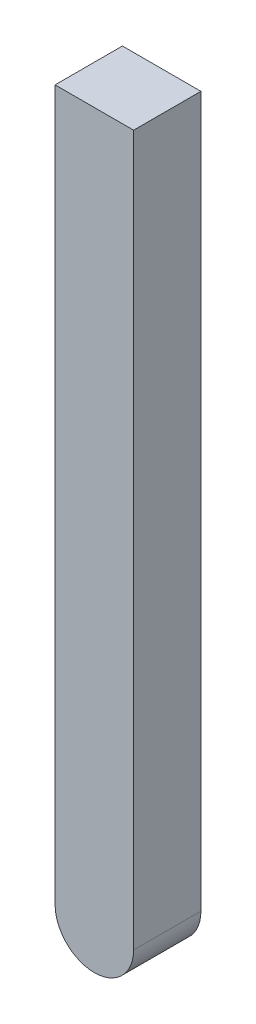
ISO-10303-21;
HEADER;
FILE_DESCRIPTION(('STEP AP214'),'2;1');
FILE_NAME('part.step','',(''),(''),'','','');
FILE_SCHEMA(('AUTOMOTIVE_DESIGN { 1 0 10303 214 1 1 1 1 }'));
ENDSEC;
DATA;
#1=APPLICATION_CONTEXT('core data for automotive mechanical design processes');
#2=APPLICATION_PROTOCOL_DEFINITION('international standard','automotive_design',2000,#1);
#3=PRODUCT_CONTEXT('',#1,'mechanical');
#4=PRODUCT('Part','Part','',(#3));
#5=PRODUCT_RELATED_PRODUCT_CATEGORY('part','',(#4));
#6=PRODUCT_DEFINITION_FORMATION('','',#4);
#7=PRODUCT_DEFINITION_CONTEXT('part definition',#1,'design');
#8=PRODUCT_DEFINITION('design','',#6,#7);
#9=PRODUCT_DEFINITION_SHAPE('','',#8);
#10=(LENGTH_UNIT() NAMED_UNIT(*) SI_UNIT(.MILLI.,.METRE.));
#11=(NAMED_UNIT(*) PLANE_ANGLE_UNIT() SI_UNIT($,.RADIAN.));
#12=(NAMED_UNIT(*) SI_UNIT($,.STERADIAN.) SOLID_ANGLE_UNIT());
#13=UNCERTAINTY_MEASURE_WITH_UNIT(LENGTH_MEASURE(1.E-05),#10,'distance_accuracy_value','');
#14=(GEOMETRIC_REPRESENTATION_CONTEXT(3) GLOBAL_UNCERTAINTY_ASSIGNED_CONTEXT((#13)) GLOBAL_UNIT_ASSIGNED_CONTEXT((#10,
#11,#12)) REPRESENTATION_CONTEXT('',''));
#15=CARTESIAN_POINT('',(0.,0.,0.));
#16=DIRECTION('',(0.,0.,1.));
#17=DIRECTION('',(1.,0.,0.));
#18=AXIS2_PLACEMENT_3D('',#15,#16,#17);
#19=CARTESIAN_POINT('',(0.350000000000001,3.165,0.3));
#20=DIRECTION('',(0.,-1.,0.));
#21=DIRECTION('',(0.,0.,-1.));
#22=AXIS2_PLACEMENT_3D('',#19,#20,#21);
#23=PLANE('',#22);
#24=DIRECTION('',(-1.,0.,0.));
#25=VECTOR('',#24,1.);
#26=CARTESIAN_POINT('',(0.350000000000001,3.165,-0.3));
#27=LINE('',#26,#25);
#28=CARTESIAN_POINT('',(0.350000000000001,3.165,-0.3));
#29=VERTEX_POINT('',#28);
#30=CARTESIAN_POINT('',(-0.349999999999999,3.165,-0.3));
#31=VERTEX_POINT('',#30);
#32=EDGE_CURVE('E96',#29,#31,#27,.T.);
#33=ORIENTED_EDGE('',*,*,#32,.T.);
#34=DIRECTION('',(0.,0.,-1.));
#35=VECTOR('',#34,1.);
#36=CARTESIAN_POINT('',(-0.349999999999999,3.165,0.3));
#37=LINE('',#36,#35);
#38=CARTESIAN_POINT('',(-0.349999999999999,3.165,0.3));
#39=VERTEX_POINT('',#38);
#40=EDGE_CURVE('E11',#39,#31,#37,.T.);
#41=ORIENTED_EDGE('',*,*,#40,.F.);
#42=DIRECTION('',(-1.,0.,0.));
#43=VECTOR('',#42,1.);
#44=CARTESIAN_POINT('',(0.350000000000001,3.165,0.3));
#45=LINE('',#44,#43);
#46=CARTESIAN_POINT('',(0.350000000000001,3.165,0.3));
#47=VERTEX_POINT('',#46);
#48=EDGE_CURVE('E84',#47,#39,#45,.T.);
#49=ORIENTED_EDGE('',*,*,#48,.F.);
#50=DIRECTION('',(0.,0.,-1.));
#51=VECTOR('',#50,1.);
#52=CARTESIAN_POINT('',(0.350000000000001,3.165,0.3));
#53=LINE('',#52,#51);
#54=EDGE_CURVE('E92',#47,#29,#53,.T.);
#55=ORIENTED_EDGE('',*,*,#54,.T.);
#56=EDGE_LOOP('',(#33,#41,#49,#55));
#57=FACE_BOUND('',#56,.T.);
#58=ADVANCED_FACE('F33',(#57),#23,.F.);
#59=CARTESIAN_POINT('',(-0.349999999999999,3.165,0.3));
#60=DIRECTION('',(1.,0.,0.));
#61=DIRECTION('',(0.,1.,0.));
#62=AXIS2_PLACEMENT_3D('',#59,#60,#61);
#63=PLANE('',#62);
#64=DIRECTION('',(0.,-1.,0.));
#65=VECTOR('',#64,1.);
#66=CARTESIAN_POINT('',(-0.349999999999999,3.165,-0.3));
#67=LINE('',#66,#65);
#68=CARTESIAN_POINT('',(-0.35,-3.165,-0.3));
#69=VERTEX_POINT('',#68);
#70=EDGE_CURVE('E88',#31,#69,#67,.T.);
#71=ORIENTED_EDGE('',*,*,#70,.T.);
#72=DIRECTION('',(0.,0.,-1.));
#73=VECTOR('',#72,1.);
#74=CARTESIAN_POINT('',(-0.35,-3.165,0.3));
#75=LINE('',#74,#73);
#76=CARTESIAN_POINT('',(-0.35,-3.165,0.3));
#77=VERTEX_POINT('',#76);
#78=EDGE_CURVE('E41',#77,#69,#75,.T.);
#79=ORIENTED_EDGE('',*,*,#78,.F.);
#80=DIRECTION('',(0.,-1.,0.));
#81=VECTOR('',#80,1.);
#82=CARTESIAN_POINT('',(-0.349999999999999,3.165,0.3));
#83=LINE('',#82,#81);
#84=EDGE_CURVE('E79',#39,#77,#83,.T.);
#85=ORIENTED_EDGE('',*,*,#84,.F.);
#86=ORIENTED_EDGE('',*,*,#40,.T.);
#87=EDGE_LOOP('',(#71,#79,#85,#86));
#88=FACE_BOUND('',#87,.T.);
#89=ADVANCED_FACE('F87',(#88),#63,.F.);
#90=CARTESIAN_POINT('',(0.,-3.165,0.3));
#91=DIRECTION('',(0.,0.,-1.));
#92=DIRECTION('',(-1.,0.,0.));
#93=AXIS2_PLACEMENT_3D('',#90,#91,#92);
#94=CYLINDRICAL_SURFACE('',#93,0.350000000000001);
#95=CARTESIAN_POINT('',(0.,-3.165,-0.3));
#96=DIRECTION('',(0.,0.,1.));
#97=DIRECTION('',(1.,0.,0.));
#98=AXIS2_PLACEMENT_3D('',#95,#96,#97);
#99=CIRCLE('',#98,0.350000000000001);
#100=CARTESIAN_POINT('',(0.350000000000001,-3.165,-0.3));
#101=VERTEX_POINT('',#100);
#102=EDGE_CURVE('E66',#69,#101,#99,.T.);
#103=ORIENTED_EDGE('',*,*,#102,.T.);
#104=DIRECTION('',(0.,0.,-1.));
#105=VECTOR('',#104,1.);
#106=CARTESIAN_POINT('',(0.350000000000001,-3.165,0.3));
#107=LINE('',#106,#105);
#108=CARTESIAN_POINT('',(0.350000000000001,-3.165,0.3));
#109=VERTEX_POINT('',#108);
#110=EDGE_CURVE('E89',#109,#101,#107,.T.);
#111=ORIENTED_EDGE('',*,*,#110,.F.);
#112=CARTESIAN_POINT('',(0.,-3.165,0.3));
#113=DIRECTION('',(0.,0.,1.));
#114=DIRECTION('',(1.,0.,0.));
#115=AXIS2_PLACEMENT_3D('',#112,#113,#114);
#116=CIRCLE('',#115,0.350000000000001);
#117=EDGE_CURVE('E82',#77,#109,#116,.T.);
#118=ORIENTED_EDGE('',*,*,#117,.F.);
#119=ORIENTED_EDGE('',*,*,#78,.T.);
#120=EDGE_LOOP('',(#103,#111,#118,#119));
#121=FACE_BOUND('',#120,.T.);
#122=ADVANCED_FACE('F90',(#121),#94,.T.);
#123=CARTESIAN_POINT('',(0.350000000000002,-3.165,0.3));
#124=DIRECTION('',(-1.,0.,0.));
#125=DIRECTION('',(0.,-1.,0.));
#126=AXIS2_PLACEMENT_3D('',#123,#124,#125);
#127=PLANE('',#126);
#128=DIRECTION('',(0.,1.,0.));
#129=VECTOR('',#128,1.);
#130=CARTESIAN_POINT('',(0.350000000000002,-3.165,-0.3));
#131=LINE('',#130,#129);
#132=EDGE_CURVE('E72',#101,#29,#131,.T.);
#133=ORIENTED_EDGE('',*,*,#132,.T.);
#134=ORIENTED_EDGE('',*,*,#54,.F.);
#135=DIRECTION('',(0.,1.,0.));
#136=VECTOR('',#135,1.);
#137=CARTESIAN_POINT('',(0.350000000000002,-3.165,0.3));
#138=LINE('',#137,#136);
#139=EDGE_CURVE('E49',#109,#47,#138,.T.);
#140=ORIENTED_EDGE('',*,*,#139,.F.);
#141=ORIENTED_EDGE('',*,*,#110,.T.);
#142=EDGE_LOOP('',(#133,#134,#140,#141));
#143=FACE_BOUND('',#142,.T.);
#144=ADVANCED_FACE('F103',(#143),#127,.F.);
#145=CARTESIAN_POINT('',(0.,-3.165,0.3));
#146=DIRECTION('',(0.,0.,1.));
#147=DIRECTION('',(1.,0.,0.));
#148=AXIS2_PLACEMENT_3D('',#145,#146,#147);
#149=PLANE('',#148);
#150=ORIENTED_EDGE('',*,*,#48,.T.);
#151=ORIENTED_EDGE('',*,*,#84,.T.);
#152=ORIENTED_EDGE('',*,*,#117,.T.);
#153=ORIENTED_EDGE('',*,*,#139,.T.);
#154=EDGE_LOOP('',(#150,#151,#152,#153));
#155=FACE_BOUND('',#154,.T.);
#156=ADVANCED_FACE('F80',(#155),#149,.T.);
#157=CARTESIAN_POINT('',(0.,-3.165,-0.3));
#158=DIRECTION('',(0.,0.,1.));
#159=DIRECTION('',(1.,0.,0.));
#160=AXIS2_PLACEMENT_3D('',#157,#158,#159);
#161=PLANE('',#160);
#162=ORIENTED_EDGE('',*,*,#32,.F.);
#163=ORIENTED_EDGE('',*,*,#132,.F.);
#164=ORIENTED_EDGE('',*,*,#102,.F.);
#165=ORIENTED_EDGE('',*,*,#70,.F.);
#166=EDGE_LOOP('',(#162,#163,#164,#165));
#167=FACE_BOUND('',#166,.T.);
#168=ADVANCED_FACE('F106',(#167),#161,.F.);
#169=CLOSED_SHELL('',(#58,#89,#122,#144,#156,#168));
#170=MANIFOLD_SOLID_BREP('B2',#169);
#171=ADVANCED_BREP_SHAPE_REPRESENTATION('',(#18,#170),#14);
#172=SHAPE_DEFINITION_REPRESENTATION(#9,#171);
ENDSEC;
END-ISO-10303-21;
